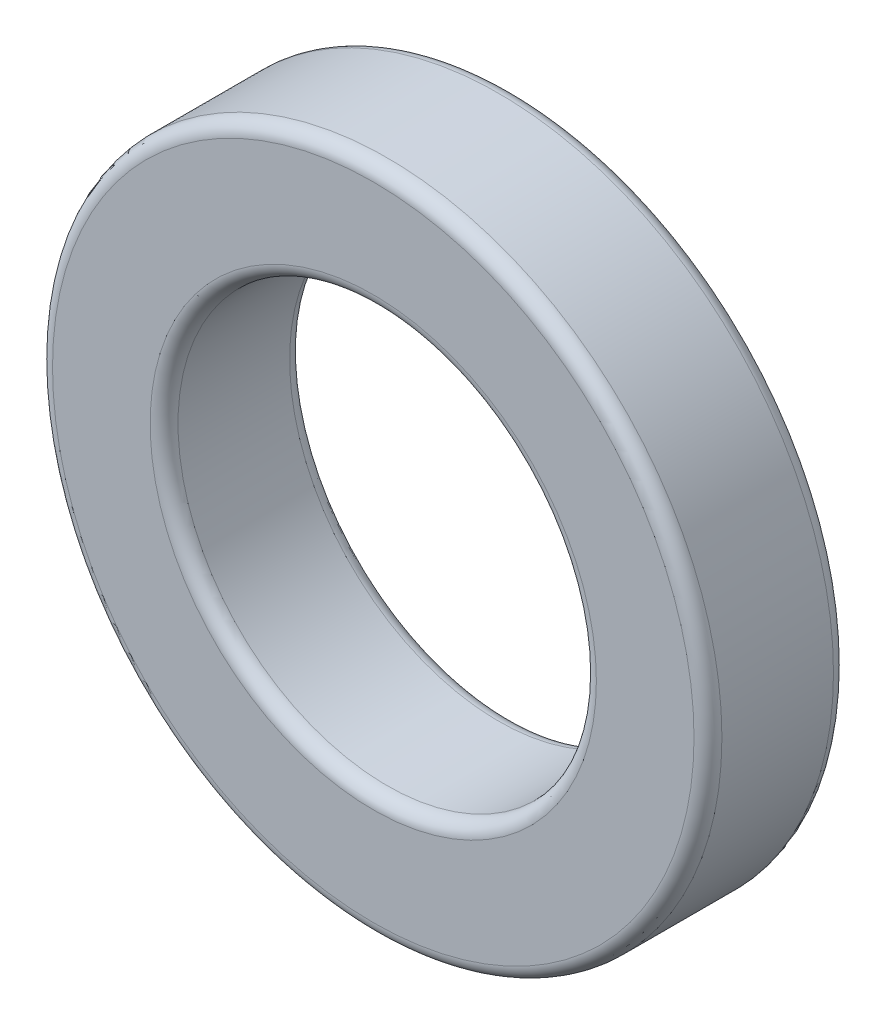
ISO-10303-21;
HEADER;
FILE_DESCRIPTION(('STEP AP214'),'2;1');
FILE_NAME('part.step','',(''),(''),'','','');
FILE_SCHEMA(('AUTOMOTIVE_DESIGN { 1 0 10303 214 1 1 1 1 }'));
ENDSEC;
DATA;
#1=APPLICATION_CONTEXT('core data for automotive mechanical design processes');
#2=APPLICATION_PROTOCOL_DEFINITION('international standard','automotive_design',2000,#1);
#3=PRODUCT_CONTEXT('',#1,'mechanical');
#4=PRODUCT('Part','Part','',(#3));
#5=PRODUCT_RELATED_PRODUCT_CATEGORY('part','',(#4));
#6=PRODUCT_DEFINITION_FORMATION('','',#4);
#7=PRODUCT_DEFINITION_CONTEXT('part definition',#1,'design');
#8=PRODUCT_DEFINITION('design','',#6,#7);
#9=PRODUCT_DEFINITION_SHAPE('','',#8);
#10=(LENGTH_UNIT() NAMED_UNIT(*) SI_UNIT(.MILLI.,.METRE.));
#11=(NAMED_UNIT(*) PLANE_ANGLE_UNIT() SI_UNIT($,.RADIAN.));
#12=(NAMED_UNIT(*) SI_UNIT($,.STERADIAN.) SOLID_ANGLE_UNIT());
#13=UNCERTAINTY_MEASURE_WITH_UNIT(LENGTH_MEASURE(1.E-05),#10,'distance_accuracy_value','');
#14=(GEOMETRIC_REPRESENTATION_CONTEXT(3) GLOBAL_UNCERTAINTY_ASSIGNED_CONTEXT((#13)) GLOBAL_UNIT_ASSIGNED_CONTEXT((#10,
#11,#12)) REPRESENTATION_CONTEXT('',''));
#15=CARTESIAN_POINT('',(0.,0.,0.));
#16=DIRECTION('',(0.,0.,1.));
#17=DIRECTION('',(1.,0.,0.));
#18=AXIS2_PLACEMENT_3D('',#15,#16,#17);
#19=CARTESIAN_POINT('',(0.,0.,5.));
#20=DIRECTION('',(0.,0.,1.));
#21=DIRECTION('',(1.,0.,0.));
#22=AXIS2_PLACEMENT_3D('',#19,#20,#21);
#23=PLANE('',#22);
#24=CARTESIAN_POINT('',(0.,0.,5.));
#25=DIRECTION('',(0.,0.,1.));
#26=DIRECTION('',(1.,0.,0.));
#27=AXIS2_PLACEMENT_3D('',#24,#25,#26);
#28=CIRCLE('',#27,8.);
#29=CARTESIAN_POINT('',(8.,0.,5.));
#30=VERTEX_POINT('',#29);
#31=EDGE_CURVE('E45',#30,#30,#28,.F.);
#32=ORIENTED_EDGE('',*,*,#31,.T.);
#33=EDGE_LOOP('',(#32));
#34=FACE_BOUND('',#33,.T.);
#35=CARTESIAN_POINT('',(0.,0.,5.));
#36=DIRECTION('',(0.,0.,1.));
#37=DIRECTION('',(1.,0.,0.));
#38=AXIS2_PLACEMENT_3D('',#35,#36,#37);
#39=CIRCLE('',#38,11.5);
#40=CARTESIAN_POINT('',(11.5,0.,5.));
#41=VERTEX_POINT('',#40);
#42=EDGE_CURVE('E49',#41,#41,#39,.T.);
#43=ORIENTED_EDGE('',*,*,#42,.T.);
#44=EDGE_LOOP('',(#43));
#45=FACE_BOUND('',#44,.T.);
#46=ADVANCED_FACE('F34',(#34,#45),#23,.T.);
#47=CARTESIAN_POINT('',(0.,0.,0.));
#48=DIRECTION('',(0.,0.,1.));
#49=DIRECTION('',(1.,0.,0.));
#50=AXIS2_PLACEMENT_3D('',#47,#48,#49);
#51=PLANE('',#50);
#52=CARTESIAN_POINT('',(0.,0.,0.));
#53=DIRECTION('',(0.,0.,1.));
#54=DIRECTION('',(1.,0.,0.));
#55=AXIS2_PLACEMENT_3D('',#52,#53,#54);
#56=CIRCLE('',#55,8.);
#57=CARTESIAN_POINT('',(8.,0.,0.));
#58=VERTEX_POINT('',#57);
#59=EDGE_CURVE('E60',#58,#58,#56,.T.);
#60=ORIENTED_EDGE('',*,*,#59,.T.);
#61=EDGE_LOOP('',(#60));
#62=FACE_BOUND('',#61,.T.);
#63=CARTESIAN_POINT('',(0.,0.,0.));
#64=DIRECTION('',(0.,0.,1.));
#65=DIRECTION('',(1.,0.,0.));
#66=AXIS2_PLACEMENT_3D('',#63,#64,#65);
#67=CIRCLE('',#66,11.5);
#68=CARTESIAN_POINT('',(11.5,0.,0.));
#69=VERTEX_POINT('',#68);
#70=EDGE_CURVE('E63',#69,#69,#67,.F.);
#71=ORIENTED_EDGE('',*,*,#70,.T.);
#72=EDGE_LOOP('',(#71));
#73=FACE_BOUND('',#72,.T.);
#74=ADVANCED_FACE('F67',(#62,#73),#51,.F.);
#75=CARTESIAN_POINT('',(0.,0.,5.));
#76=DIRECTION('',(0.,0.,-1.));
#77=DIRECTION('',(-1.,0.,0.));
#78=AXIS2_PLACEMENT_3D('',#75,#76,#77);
#79=CYLINDRICAL_SURFACE('',#78,12.);
#80=CARTESIAN_POINT('',(0.,0.,0.5));
#81=DIRECTION('',(0.,0.,1.));
#82=DIRECTION('',(1.,0.,0.));
#83=AXIS2_PLACEMENT_3D('',#80,#81,#82);
#84=CIRCLE('',#83,12.);
#85=CARTESIAN_POINT('',(12.,0.,0.5));
#86=VERTEX_POINT('',#85);
#87=EDGE_CURVE('E10',#86,#86,#84,.T.);
#88=ORIENTED_EDGE('',*,*,#87,.T.);
#89=EDGE_LOOP('',(#88));
#90=FACE_BOUND('',#89,.T.);
#91=CARTESIAN_POINT('',(0.,0.,4.5));
#92=DIRECTION('',(0.,0.,1.));
#93=DIRECTION('',(1.,0.,0.));
#94=AXIS2_PLACEMENT_3D('',#91,#92,#93);
#95=CIRCLE('',#94,12.);
#96=CARTESIAN_POINT('',(12.,0.,4.5));
#97=VERTEX_POINT('',#96);
#98=EDGE_CURVE('E41',#97,#97,#95,.F.);
#99=ORIENTED_EDGE('',*,*,#98,.T.);
#100=EDGE_LOOP('',(#99));
#101=FACE_BOUND('',#100,.T.);
#102=ADVANCED_FACE('F87',(#90,#101),#79,.T.);
#103=CARTESIAN_POINT('',(0.,0.,5.));
#104=DIRECTION('',(0.,0.,-1.));
#105=DIRECTION('',(-1.,0.,0.));
#106=AXIS2_PLACEMENT_3D('',#103,#104,#105);
#107=CYLINDRICAL_SURFACE('',#106,7.5);
#108=CARTESIAN_POINT('',(0.,0.,0.5));
#109=DIRECTION('',(0.,0.,1.));
#110=DIRECTION('',(1.,0.,0.));
#111=AXIS2_PLACEMENT_3D('',#108,#109,#110);
#112=CIRCLE('',#111,7.5);
#113=CARTESIAN_POINT('',(7.5,0.,0.5));
#114=VERTEX_POINT('',#113);
#115=EDGE_CURVE('E54',#114,#114,#112,.F.);
#116=ORIENTED_EDGE('',*,*,#115,.T.);
#117=EDGE_LOOP('',(#116));
#118=FACE_BOUND('',#117,.T.);
#119=CARTESIAN_POINT('',(0.,0.,4.5));
#120=DIRECTION('',(0.,0.,1.));
#121=DIRECTION('',(1.,0.,0.));
#122=AXIS2_PLACEMENT_3D('',#119,#120,#121);
#123=CIRCLE('',#122,7.5);
#124=CARTESIAN_POINT('',(7.5,0.,4.5));
#125=VERTEX_POINT('',#124);
#126=EDGE_CURVE('E57',#125,#125,#123,.T.);
#127=ORIENTED_EDGE('',*,*,#126,.T.);
#128=EDGE_LOOP('',(#127));
#129=FACE_BOUND('',#128,.T.);
#130=ADVANCED_FACE('F92',(#118,#129),#107,.F.);
#131=CARTESIAN_POINT('',(0.,0.,0.5));
#132=DIRECTION('',(0.,0.,1.));
#133=DIRECTION('',(1.,0.,0.));
#134=AXIS2_PLACEMENT_3D('',#131,#132,#133);
#135=TOROIDAL_SURFACE('',#134,8.,0.5);
#136=ORIENTED_EDGE('',*,*,#115,.F.);
#137=EDGE_LOOP('',(#136));
#138=FACE_BOUND('',#137,.T.);
#139=ORIENTED_EDGE('',*,*,#59,.F.);
#140=EDGE_LOOP('',(#139));
#141=FACE_BOUND('',#140,.T.);
#142=ADVANCED_FACE('F78',(#138,#141),#135,.T.);
#143=CARTESIAN_POINT('',(0.,0.,4.5));
#144=DIRECTION('',(0.,0.,1.));
#145=DIRECTION('',(1.,0.,0.));
#146=AXIS2_PLACEMENT_3D('',#143,#144,#145);
#147=TOROIDAL_SURFACE('',#146,8.,0.5);
#148=ORIENTED_EDGE('',*,*,#31,.F.);
#149=EDGE_LOOP('',(#148));
#150=FACE_BOUND('',#149,.T.);
#151=ORIENTED_EDGE('',*,*,#126,.F.);
#152=EDGE_LOOP('',(#151));
#153=FACE_BOUND('',#152,.T.);
#154=ADVANCED_FACE('F72',(#150,#153),#147,.T.);
#155=CARTESIAN_POINT('',(0.,0.,0.5));
#156=DIRECTION('',(0.,0.,1.));
#157=DIRECTION('',(1.,0.,0.));
#158=AXIS2_PLACEMENT_3D('',#155,#156,#157);
#159=TOROIDAL_SURFACE('',#158,11.5,0.5);
#160=ORIENTED_EDGE('',*,*,#70,.F.);
#161=EDGE_LOOP('',(#160));
#162=FACE_BOUND('',#161,.T.);
#163=ORIENTED_EDGE('',*,*,#87,.F.);
#164=EDGE_LOOP('',(#163));
#165=FACE_BOUND('',#164,.T.);
#166=ADVANCED_FACE('F69',(#162,#165),#159,.T.);
#167=CARTESIAN_POINT('',(0.,0.,4.5));
#168=DIRECTION('',(0.,0.,1.));
#169=DIRECTION('',(1.,0.,0.));
#170=AXIS2_PLACEMENT_3D('',#167,#168,#169);
#171=TOROIDAL_SURFACE('',#170,11.5,0.5);
#172=ORIENTED_EDGE('',*,*,#98,.F.);
#173=EDGE_LOOP('',(#172));
#174=FACE_BOUND('',#173,.T.);
#175=ORIENTED_EDGE('',*,*,#42,.F.);
#176=EDGE_LOOP('',(#175));
#177=FACE_BOUND('',#176,.T.);
#178=ADVANCED_FACE('F36',(#174,#177),#171,.T.);
#179=CLOSED_SHELL('',(#46,#74,#102,#130,#142,#154,#166,#178));
#180=MANIFOLD_SOLID_BREP('B2',#179);
#181=ADVANCED_BREP_SHAPE_REPRESENTATION('',(#18,#180),#14);
#182=SHAPE_DEFINITION_REPRESENTATION(#9,#181);
ENDSEC;
END-ISO-10303-21;
